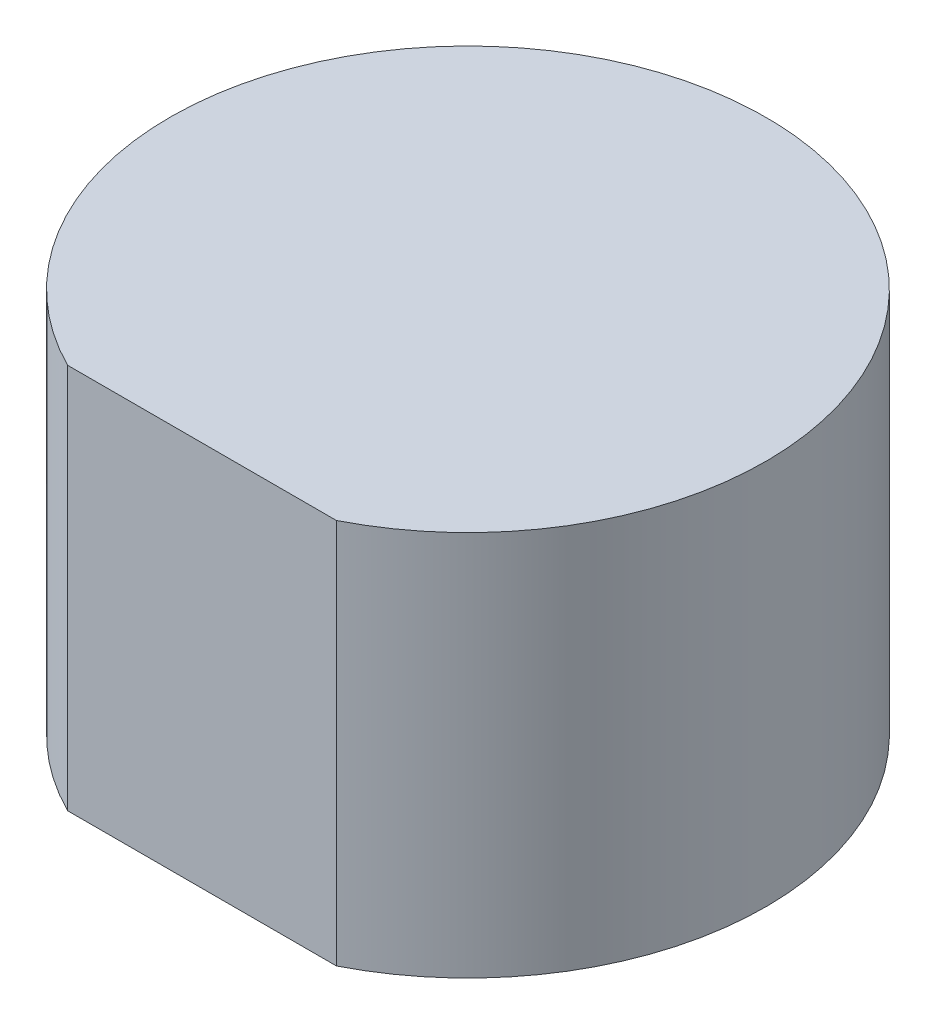
ISO-10303-21;
HEADER;
FILE_DESCRIPTION(('STEP AP214'),'2;1');
FILE_NAME('part.step','',(''),(''),'','','');
FILE_SCHEMA(('AUTOMOTIVE_DESIGN { 1 0 10303 214 1 1 1 1 }'));
ENDSEC;
DATA;
#1=APPLICATION_CONTEXT('core data for automotive mechanical design processes');
#2=APPLICATION_PROTOCOL_DEFINITION('international standard','automotive_design',2000,#1);
#3=PRODUCT_CONTEXT('',#1,'mechanical');
#4=PRODUCT('Part','Part','',(#3));
#5=PRODUCT_RELATED_PRODUCT_CATEGORY('part','',(#4));
#6=PRODUCT_DEFINITION_FORMATION('','',#4);
#7=PRODUCT_DEFINITION_CONTEXT('part definition',#1,'design');
#8=PRODUCT_DEFINITION('design','',#6,#7);
#9=PRODUCT_DEFINITION_SHAPE('','',#8);
#10=(LENGTH_UNIT() NAMED_UNIT(*) SI_UNIT(.MILLI.,.METRE.));
#11=(NAMED_UNIT(*) PLANE_ANGLE_UNIT() SI_UNIT($,.RADIAN.));
#12=(NAMED_UNIT(*) SI_UNIT($,.STERADIAN.) SOLID_ANGLE_UNIT());
#13=UNCERTAINTY_MEASURE_WITH_UNIT(LENGTH_MEASURE(1.E-05),#10,'distance_accuracy_value','');
#14=(GEOMETRIC_REPRESENTATION_CONTEXT(3) GLOBAL_UNCERTAINTY_ASSIGNED_CONTEXT((#13)) GLOBAL_UNIT_ASSIGNED_CONTEXT((#10,
#11,#12)) REPRESENTATION_CONTEXT('',''));
#15=CARTESIAN_POINT('',(0.,0.,0.));
#16=DIRECTION('',(0.,0.,1.));
#17=DIRECTION('',(1.,0.,0.));
#18=AXIS2_PLACEMENT_3D('',#15,#16,#17);
#19=CARTESIAN_POINT('',(0.,33.,0.));
#20=DIRECTION('',(0.,-1.,0.));
#21=DIRECTION('',(0.,0.,-1.));
#22=AXIS2_PLACEMENT_3D('',#19,#20,#21);
#23=CYLINDRICAL_SURFACE('',#22,25.49);
#24=CARTESIAN_POINT('',(0.,0.,0.));
#25=DIRECTION('',(0.,1.,0.));
#26=DIRECTION('',(0.,0.,1.));
#27=AXIS2_PLACEMENT_3D('',#24,#25,#26);
#28=CIRCLE('',#27,25.49);
#29=CARTESIAN_POINT('',(11.5,0.,22.7484087355577));
#30=VERTEX_POINT('',#29);
#31=CARTESIAN_POINT('',(-11.5,0.,22.7484087355577));
#32=VERTEX_POINT('',#31);
#33=EDGE_CURVE('E67',#30,#32,#28,.T.);
#34=ORIENTED_EDGE('',*,*,#33,.T.);
#35=DIRECTION('',(0.,-1.,0.));
#36=VECTOR('',#35,1.);
#37=CARTESIAN_POINT('',(-11.5,33.,22.7484087355577));
#38=LINE('',#37,#36);
#39=CARTESIAN_POINT('',(-11.5,33.,22.7484087355577));
#40=VERTEX_POINT('',#39);
#41=EDGE_CURVE('E11',#40,#32,#38,.T.);
#42=ORIENTED_EDGE('',*,*,#41,.F.);
#43=CARTESIAN_POINT('',(0.,33.,0.));
#44=DIRECTION('',(0.,1.,0.));
#45=DIRECTION('',(0.,0.,1.));
#46=AXIS2_PLACEMENT_3D('',#43,#44,#45);
#47=CIRCLE('',#46,25.49);
#48=CARTESIAN_POINT('',(11.5,33.,22.7484087355577));
#49=VERTEX_POINT('',#48);
#50=EDGE_CURVE('E66',#49,#40,#47,.T.);
#51=ORIENTED_EDGE('',*,*,#50,.F.);
#52=DIRECTION('',(0.,-1.,0.));
#53=VECTOR('',#52,1.);
#54=CARTESIAN_POINT('',(11.5,33.,22.7484087355577));
#55=LINE('',#54,#53);
#56=EDGE_CURVE('E44',#49,#30,#55,.T.);
#57=ORIENTED_EDGE('',*,*,#56,.T.);
#58=EDGE_LOOP('',(#34,#42,#51,#57));
#59=FACE_BOUND('',#58,.T.);
#60=ADVANCED_FACE('F36',(#59),#23,.T.);
#61=CARTESIAN_POINT('',(11.5,33.,22.7484087355577));
#62=DIRECTION('',(0.,0.,-1.));
#63=DIRECTION('',(-1.,0.,0.));
#64=AXIS2_PLACEMENT_3D('',#61,#62,#63);
#65=PLANE('',#64);
#66=DIRECTION('',(1.,0.,0.));
#67=VECTOR('',#66,1.);
#68=CARTESIAN_POINT('',(11.5,0.,22.7484087355577));
#69=LINE('',#68,#67);
#70=EDGE_CURVE('E59',#32,#30,#69,.T.);
#71=ORIENTED_EDGE('',*,*,#70,.T.);
#72=ORIENTED_EDGE('',*,*,#56,.F.);
#73=DIRECTION('',(1.,0.,0.));
#74=VECTOR('',#73,1.);
#75=CARTESIAN_POINT('',(11.5,33.,22.7484087355577));
#76=LINE('',#75,#74);
#77=EDGE_CURVE('E51',#40,#49,#76,.T.);
#78=ORIENTED_EDGE('',*,*,#77,.F.);
#79=ORIENTED_EDGE('',*,*,#41,.T.);
#80=EDGE_LOOP('',(#71,#72,#78,#79));
#81=FACE_BOUND('',#80,.T.);
#82=ADVANCED_FACE('F62',(#81),#65,.F.);
#83=CARTESIAN_POINT('',(0.,33.,0.));
#84=DIRECTION('',(0.,1.,0.));
#85=DIRECTION('',(0.,0.,1.));
#86=AXIS2_PLACEMENT_3D('',#83,#84,#85);
#87=PLANE('',#86);
#88=ORIENTED_EDGE('',*,*,#50,.T.);
#89=ORIENTED_EDGE('',*,*,#77,.T.);
#90=EDGE_LOOP('',(#88,#89));
#91=FACE_BOUND('',#90,.T.);
#92=ADVANCED_FACE('F74',(#91),#87,.T.);
#93=CARTESIAN_POINT('',(0.,0.,0.));
#94=DIRECTION('',(0.,1.,0.));
#95=DIRECTION('',(0.,0.,1.));
#96=AXIS2_PLACEMENT_3D('',#93,#94,#95);
#97=PLANE('',#96);
#98=ORIENTED_EDGE('',*,*,#33,.F.);
#99=ORIENTED_EDGE('',*,*,#70,.F.);
#100=EDGE_LOOP('',(#98,#99));
#101=FACE_BOUND('',#100,.T.);
#102=ADVANCED_FACE('F70',(#101),#97,.F.);
#103=CLOSED_SHELL('',(#60,#82,#92,#102));
#104=MANIFOLD_SOLID_BREP('B2',#103);
#105=ADVANCED_BREP_SHAPE_REPRESENTATION('',(#18,#104),#14);
#106=SHAPE_DEFINITION_REPRESENTATION(#9,#105);
ENDSEC;
END-ISO-10303-21;
